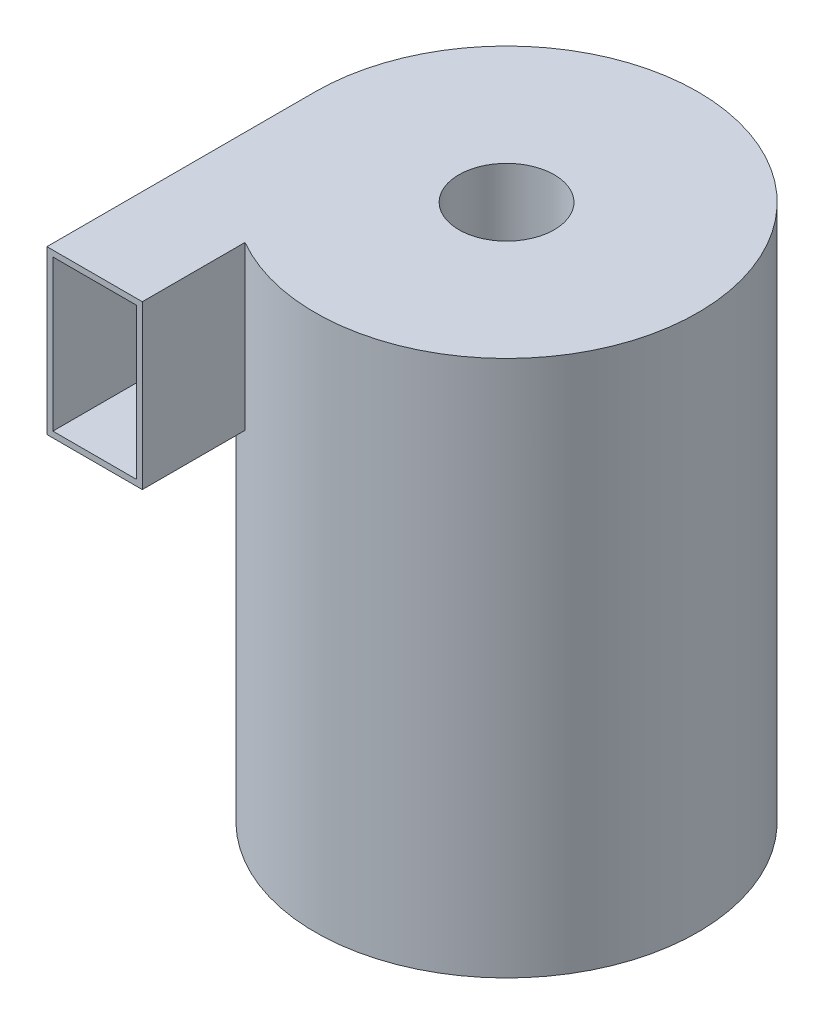
ISO-10303-21;
HEADER;
FILE_DESCRIPTION(('STEP AP214'),'2;1');
FILE_NAME('part.step','',(''),(''),'','','');
FILE_SCHEMA(('AUTOMOTIVE_DESIGN { 1 0 10303 214 1 1 1 1 }'));
ENDSEC;
DATA;
#1=APPLICATION_CONTEXT('core data for automotive mechanical design processes');
#2=APPLICATION_PROTOCOL_DEFINITION('international standard','automotive_design',2000,#1);
#3=PRODUCT_CONTEXT('',#1,'mechanical');
#4=PRODUCT('Part','Part','',(#3));
#5=PRODUCT_RELATED_PRODUCT_CATEGORY('part','',(#4));
#6=PRODUCT_DEFINITION_FORMATION('','',#4);
#7=PRODUCT_DEFINITION_CONTEXT('part definition',#1,'design');
#8=PRODUCT_DEFINITION('design','',#6,#7);
#9=PRODUCT_DEFINITION_SHAPE('','',#8);
#10=(LENGTH_UNIT() NAMED_UNIT(*) SI_UNIT(.MILLI.,.METRE.));
#11=(NAMED_UNIT(*) PLANE_ANGLE_UNIT() SI_UNIT($,.RADIAN.));
#12=(NAMED_UNIT(*) SI_UNIT($,.STERADIAN.) SOLID_ANGLE_UNIT());
#13=UNCERTAINTY_MEASURE_WITH_UNIT(LENGTH_MEASURE(1.E-05),#10,'distance_accuracy_value','');
#14=(GEOMETRIC_REPRESENTATION_CONTEXT(3) GLOBAL_UNCERTAINTY_ASSIGNED_CONTEXT((#13)) GLOBAL_UNIT_ASSIGNED_CONTEXT((#10,
#11,#12)) REPRESENTATION_CONTEXT('',''));
#15=CARTESIAN_POINT('',(0.,0.,0.));
#16=DIRECTION('',(0.,0.,1.));
#17=DIRECTION('',(1.,0.,0.));
#18=AXIS2_PLACEMENT_3D('',#15,#16,#17);
#19=CARTESIAN_POINT('',(0.,0.,0.));
#20=DIRECTION('',(0.,-1.,0.));
#21=DIRECTION('',(0.,0.,-1.));
#22=AXIS2_PLACEMENT_3D('',#19,#20,#21);
#23=CYLINDRICAL_SURFACE('',#22,32.1);
#24=CARTESIAN_POINT('',(0.,0.,0.));
#25=DIRECTION('',(0.,-1.,0.));
#26=DIRECTION('',(0.,0.,-1.));
#27=AXIS2_PLACEMENT_3D('',#24,#25,#26);
#28=CIRCLE('',#27,32.1);
#29=CARTESIAN_POINT('',(0.,0.,-32.1));
#30=VERTEX_POINT('',#29);
#31=EDGE_CURVE('E199',#30,#30,#28,.T.);
#32=ORIENTED_EDGE('',*,*,#31,.F.);
#33=EDGE_LOOP('',(#32));
#34=FACE_BOUND('',#33,.T.);
#35=CARTESIAN_POINT('',(0.,90.,0.));
#36=DIRECTION('',(0.,-1.,0.));
#37=DIRECTION('',(0.,0.,-1.));
#38=AXIS2_PLACEMENT_3D('',#35,#36,#37);
#39=CIRCLE('',#38,32.1);
#40=CARTESIAN_POINT('',(-32.1,90.,0.));
#41=VERTEX_POINT('',#40);
#42=CARTESIAN_POINT('',(-16.1,90.,27.7704879323357));
#43=VERTEX_POINT('',#42);
#44=EDGE_CURVE('E203',#41,#43,#39,.T.);
#45=ORIENTED_EDGE('',*,*,#44,.T.);
#46=DIRECTION('',(0.,-1.,0.));
#47=VECTOR('',#46,1.);
#48=CARTESIAN_POINT('',(-16.1,0.,27.7704879323357));
#49=LINE('',#48,#47);
#50=CARTESIAN_POINT('',(-16.1,62.7,27.7704879323357));
#51=VERTEX_POINT('',#50);
#52=EDGE_CURVE('E11',#43,#51,#49,.T.);
#53=ORIENTED_EDGE('',*,*,#52,.T.);
#54=CARTESIAN_POINT('',(0.,62.7,0.));
#55=DIRECTION('',(0.,1.,0.));
#56=DIRECTION('',(0.,0.,1.));
#57=AXIS2_PLACEMENT_3D('',#54,#55,#56);
#58=CIRCLE('',#57,32.1);
#59=CARTESIAN_POINT('',(-32.1,62.7,0.));
#60=VERTEX_POINT('',#59);
#61=EDGE_CURVE('E48',#51,#60,#58,.F.);
#62=ORIENTED_EDGE('',*,*,#61,.T.);
#63=DIRECTION('',(0.,-1.,0.));
#64=VECTOR('',#63,1.);
#65=CARTESIAN_POINT('',(-32.1,90.,0.));
#66=LINE('',#65,#64);
#67=EDGE_CURVE('E175',#41,#60,#66,.T.);
#68=ORIENTED_EDGE('',*,*,#67,.F.);
#69=EDGE_LOOP('',(#45,#53,#62,#68));
#70=FACE_BOUND('',#69,.T.);
#71=ADVANCED_FACE('F39',(#34,#70),#23,.T.);
#72=CARTESIAN_POINT('',(0.,0.,0.));
#73=DIRECTION('',(0.,-1.,0.));
#74=DIRECTION('',(0.,0.,-1.));
#75=AXIS2_PLACEMENT_3D('',#72,#73,#74);
#76=CYLINDRICAL_SURFACE('',#75,8.);
#77=CARTESIAN_POINT('',(0.,19.,0.));
#78=DIRECTION('',(0.,-1.,0.));
#79=DIRECTION('',(0.,0.,-1.));
#80=AXIS2_PLACEMENT_3D('',#77,#78,#79);
#81=CIRCLE('',#80,8.);
#82=CARTESIAN_POINT('',(0.,19.,-8.));
#83=VERTEX_POINT('',#82);
#84=EDGE_CURVE('E118',#83,#83,#81,.T.);
#85=ORIENTED_EDGE('',*,*,#84,.T.);
#86=EDGE_LOOP('',(#85));
#87=FACE_BOUND('',#86,.T.);
#88=CARTESIAN_POINT('',(0.,90.,0.));
#89=DIRECTION('',(0.,-1.,0.));
#90=DIRECTION('',(0.,0.,-1.));
#91=AXIS2_PLACEMENT_3D('',#88,#89,#90);
#92=CIRCLE('',#91,8.);
#93=CARTESIAN_POINT('',(0.,90.,-8.));
#94=VERTEX_POINT('',#93);
#95=EDGE_CURVE('E207',#94,#94,#92,.T.);
#96=ORIENTED_EDGE('',*,*,#95,.F.);
#97=EDGE_LOOP('',(#96));
#98=FACE_BOUND('',#97,.T.);
#99=ADVANCED_FACE('F41',(#87,#98),#76,.F.);
#100=CARTESIAN_POINT('',(8.,90.,0.));
#101=DIRECTION('',(0.,1.,0.));
#102=DIRECTION('',(0.,0.,1.));
#103=AXIS2_PLACEMENT_3D('',#100,#101,#102);
#104=PLANE('',#103);
#105=DIRECTION('',(0.,0.,-1.));
#106=VECTOR('',#105,1.);
#107=CARTESIAN_POINT('',(-16.1,90.,45.));
#108=LINE('',#107,#106);
#109=CARTESIAN_POINT('',(-16.1,90.,45.));
#110=VERTEX_POINT('',#109);
#111=EDGE_CURVE('E188',#110,#43,#108,.T.);
#112=ORIENTED_EDGE('',*,*,#111,.T.);
#113=ORIENTED_EDGE('',*,*,#44,.F.);
#114=DIRECTION('',(0.,0.,-1.));
#115=VECTOR('',#114,1.);
#116=CARTESIAN_POINT('',(-32.1,90.,45.));
#117=LINE('',#116,#115);
#118=CARTESIAN_POINT('',(-32.1,90.,45.));
#119=VERTEX_POINT('',#118);
#120=EDGE_CURVE('E63',#119,#41,#117,.T.);
#121=ORIENTED_EDGE('',*,*,#120,.F.);
#122=DIRECTION('',(-1.,0.,0.));
#123=VECTOR('',#122,1.);
#124=CARTESIAN_POINT('',(-32.1,90.,45.));
#125=LINE('',#124,#123);
#126=EDGE_CURVE('E181',#110,#119,#125,.T.);
#127=ORIENTED_EDGE('',*,*,#126,.F.);
#128=EDGE_LOOP('',(#112,#113,#121,#127));
#129=FACE_BOUND('',#128,.T.);
#130=ORIENTED_EDGE('',*,*,#95,.T.);
#131=EDGE_LOOP('',(#130));
#132=FACE_BOUND('',#131,.T.);
#133=ADVANCED_FACE('F237',(#129,#132),#104,.T.);
#134=CARTESIAN_POINT('',(32.1,0.,0.));
#135=DIRECTION('',(0.,-1.,0.));
#136=DIRECTION('',(0.,0.,-1.));
#137=AXIS2_PLACEMENT_3D('',#134,#135,#136);
#138=PLANE('',#137);
#139=CARTESIAN_POINT('',(0.,0.,0.));
#140=DIRECTION('',(0.,-1.,0.));
#141=DIRECTION('',(0.,0.,-1.));
#142=AXIS2_PLACEMENT_3D('',#139,#140,#141);
#143=CIRCLE('',#142,31.1);
#144=CARTESIAN_POINT('',(0.,0.,-31.1));
#145=VERTEX_POINT('',#144);
#146=EDGE_CURVE('E134',#145,#145,#143,.T.);
#147=ORIENTED_EDGE('',*,*,#146,.F.);
#148=EDGE_LOOP('',(#147));
#149=FACE_BOUND('',#148,.T.);
#150=ORIENTED_EDGE('',*,*,#31,.T.);
#151=EDGE_LOOP('',(#150));
#152=FACE_BOUND('',#151,.T.);
#153=ADVANCED_FACE('F230',(#149,#152),#138,.T.);
#154=CARTESIAN_POINT('',(-32.1,90.,45.));
#155=DIRECTION('',(1.,0.,0.));
#156=DIRECTION('',(0.,0.,-1.));
#157=AXIS2_PLACEMENT_3D('',#154,#155,#156);
#158=PLANE('',#157);
#159=ORIENTED_EDGE('',*,*,#67,.T.);
#160=DIRECTION('',(0.,0.,-1.));
#161=VECTOR('',#160,1.);
#162=CARTESIAN_POINT('',(-32.1,62.7,45.));
#163=LINE('',#162,#161);
#164=CARTESIAN_POINT('',(-32.1,62.7,45.));
#165=VERTEX_POINT('',#164);
#166=EDGE_CURVE('E196',#165,#60,#163,.T.);
#167=ORIENTED_EDGE('',*,*,#166,.F.);
#168=DIRECTION('',(0.,-1.,0.));
#169=VECTOR('',#168,1.);
#170=CARTESIAN_POINT('',(-32.1,90.,45.));
#171=LINE('',#170,#169);
#172=EDGE_CURVE('E170',#119,#165,#171,.T.);
#173=ORIENTED_EDGE('',*,*,#172,.F.);
#174=ORIENTED_EDGE('',*,*,#120,.T.);
#175=EDGE_LOOP('',(#159,#167,#173,#174));
#176=FACE_BOUND('',#175,.T.);
#177=ADVANCED_FACE('F228',(#176),#158,.F.);
#178=CARTESIAN_POINT('',(-32.1,62.7,45.));
#179=DIRECTION('',(0.,1.,0.));
#180=DIRECTION('',(0.,0.,1.));
#181=AXIS2_PLACEMENT_3D('',#178,#179,#180);
#182=PLANE('',#181);
#183=ORIENTED_EDGE('',*,*,#61,.F.);
#184=DIRECTION('',(0.,0.,-1.));
#185=VECTOR('',#184,1.);
#186=CARTESIAN_POINT('',(-16.1,62.7,45.));
#187=LINE('',#186,#185);
#188=CARTESIAN_POINT('',(-16.1,62.7,45.));
#189=VERTEX_POINT('',#188);
#190=EDGE_CURVE('E192',#189,#51,#187,.T.);
#191=ORIENTED_EDGE('',*,*,#190,.F.);
#192=DIRECTION('',(1.,0.,0.));
#193=VECTOR('',#192,1.);
#194=CARTESIAN_POINT('',(-32.1,62.7,45.));
#195=LINE('',#194,#193);
#196=EDGE_CURVE('E174',#165,#189,#195,.T.);
#197=ORIENTED_EDGE('',*,*,#196,.F.);
#198=ORIENTED_EDGE('',*,*,#166,.T.);
#199=EDGE_LOOP('',(#183,#191,#197,#198));
#200=FACE_BOUND('',#199,.T.);
#201=ADVANCED_FACE('F219',(#200),#182,.F.);
#202=CARTESIAN_POINT('',(-16.1,90.,45.));
#203=DIRECTION('',(-1.,0.,0.));
#204=DIRECTION('',(0.,0.,1.));
#205=AXIS2_PLACEMENT_3D('',#202,#203,#204);
#206=PLANE('',#205);
#207=ORIENTED_EDGE('',*,*,#52,.F.);
#208=ORIENTED_EDGE('',*,*,#111,.F.);
#209=DIRECTION('',(0.,1.,0.));
#210=VECTOR('',#209,1.);
#211=CARTESIAN_POINT('',(-16.1,90.,45.));
#212=LINE('',#211,#210);
#213=EDGE_CURVE('E178',#189,#110,#212,.T.);
#214=ORIENTED_EDGE('',*,*,#213,.F.);
#215=ORIENTED_EDGE('',*,*,#190,.T.);
#216=EDGE_LOOP('',(#207,#208,#214,#215));
#217=FACE_BOUND('',#216,.T.);
#218=ADVANCED_FACE('F223',(#217),#206,.F.);
#219=CARTESIAN_POINT('',(0.,0.,45.));
#220=DIRECTION('',(0.,0.,1.));
#221=DIRECTION('',(1.,0.,0.));
#222=AXIS2_PLACEMENT_3D('',#219,#220,#221);
#223=PLANE('',#222);
#224=DIRECTION('',(0.,-1.,0.));
#225=VECTOR('',#224,1.);
#226=CARTESIAN_POINT('',(-31.1,90.,45.));
#227=LINE('',#226,#225);
#228=CARTESIAN_POINT('',(-31.1,89.,45.));
#229=VERTEX_POINT('',#228);
#230=CARTESIAN_POINT('',(-31.1,63.7,45.));
#231=VERTEX_POINT('',#230);
#232=EDGE_CURVE('E149',#229,#231,#227,.T.);
#233=ORIENTED_EDGE('',*,*,#232,.F.);
#234=DIRECTION('',(-1.,0.,0.));
#235=VECTOR('',#234,1.);
#236=CARTESIAN_POINT('',(0.,89.,45.));
#237=LINE('',#236,#235);
#238=CARTESIAN_POINT('',(-17.1,89.,45.));
#239=VERTEX_POINT('',#238);
#240=EDGE_CURVE('E152',#239,#229,#237,.T.);
#241=ORIENTED_EDGE('',*,*,#240,.F.);
#242=DIRECTION('',(0.,1.,0.));
#243=VECTOR('',#242,1.);
#244=CARTESIAN_POINT('',(-17.1,90.,45.));
#245=LINE('',#244,#243);
#246=CARTESIAN_POINT('',(-17.1,63.7,45.));
#247=VERTEX_POINT('',#246);
#248=EDGE_CURVE('E122',#247,#239,#245,.T.);
#249=ORIENTED_EDGE('',*,*,#248,.F.);
#250=DIRECTION('',(1.,0.,0.));
#251=VECTOR('',#250,1.);
#252=CARTESIAN_POINT('',(-32.1,63.7,45.));
#253=LINE('',#252,#251);
#254=EDGE_CURVE('E162',#231,#247,#253,.T.);
#255=ORIENTED_EDGE('',*,*,#254,.F.);
#256=EDGE_LOOP('',(#233,#241,#249,#255));
#257=FACE_BOUND('',#256,.T.);
#258=ORIENTED_EDGE('',*,*,#172,.T.);
#259=ORIENTED_EDGE('',*,*,#196,.T.);
#260=ORIENTED_EDGE('',*,*,#213,.T.);
#261=ORIENTED_EDGE('',*,*,#126,.T.);
#262=EDGE_LOOP('',(#258,#259,#260,#261));
#263=FACE_BOUND('',#262,.T.);
#264=ADVANCED_FACE('F227',(#257,#263),#223,.T.);
#265=CARTESIAN_POINT('',(0.,19.,0.));
#266=DIRECTION('',(0.,1.,0.));
#267=DIRECTION('',(0.,0.,1.));
#268=AXIS2_PLACEMENT_3D('',#265,#266,#267);
#269=PLANE('',#268);
#270=CARTESIAN_POINT('',(0.,19.,0.));
#271=DIRECTION('',(0.,1.,0.));
#272=DIRECTION('',(0.,0.,1.));
#273=AXIS2_PLACEMENT_3D('',#270,#271,#272);
#274=CIRCLE('',#273,9.);
#275=CARTESIAN_POINT('',(0.,19.,9.));
#276=VERTEX_POINT('',#275);
#277=EDGE_CURVE('E139',#276,#276,#274,.F.);
#278=ORIENTED_EDGE('',*,*,#277,.T.);
#279=EDGE_LOOP('',(#278));
#280=FACE_BOUND('',#279,.T.);
#281=ORIENTED_EDGE('',*,*,#84,.F.);
#282=EDGE_LOOP('',(#281));
#283=FACE_BOUND('',#282,.T.);
#284=ADVANCED_FACE('F277',(#280,#283),#269,.F.);
#285=CARTESIAN_POINT('',(0.,0.,0.));
#286=DIRECTION('',(0.,-1.,0.));
#287=DIRECTION('',(0.,0.,-1.));
#288=AXIS2_PLACEMENT_3D('',#285,#286,#287);
#289=CYLINDRICAL_SURFACE('',#288,31.1);
#290=ORIENTED_EDGE('',*,*,#146,.T.);
#291=EDGE_LOOP('',(#290));
#292=FACE_BOUND('',#291,.T.);
#293=CARTESIAN_POINT('',(0.,89.,0.));
#294=DIRECTION('',(0.,1.,0.));
#295=DIRECTION('',(0.,0.,1.));
#296=AXIS2_PLACEMENT_3D('',#293,#294,#295);
#297=CIRCLE('',#296,31.1);
#298=CARTESIAN_POINT('',(-31.1,89.,0.));
#299=VERTEX_POINT('',#298);
#300=CARTESIAN_POINT('',(-17.1,89.,25.9769128265851));
#301=VERTEX_POINT('',#300);
#302=EDGE_CURVE('E111',#299,#301,#297,.F.);
#303=ORIENTED_EDGE('',*,*,#302,.F.);
#304=DIRECTION('',(0.,1.,0.));
#305=VECTOR('',#304,1.);
#306=CARTESIAN_POINT('',(-31.1,90.,0.));
#307=LINE('',#306,#305);
#308=CARTESIAN_POINT('',(-31.1,63.7,0.));
#309=VERTEX_POINT('',#308);
#310=EDGE_CURVE('E147',#299,#309,#307,.F.);
#311=ORIENTED_EDGE('',*,*,#310,.T.);
#312=CARTESIAN_POINT('',(0.,63.7,0.));
#313=DIRECTION('',(0.,1.,0.));
#314=DIRECTION('',(0.,0.,1.));
#315=AXIS2_PLACEMENT_3D('',#312,#313,#314);
#316=CIRCLE('',#315,31.1);
#317=CARTESIAN_POINT('',(-17.1,63.7,25.9769128265851));
#318=VERTEX_POINT('',#317);
#319=EDGE_CURVE('E113',#318,#309,#316,.F.);
#320=ORIENTED_EDGE('',*,*,#319,.F.);
#321=DIRECTION('',(0.,-1.,0.));
#322=VECTOR('',#321,1.);
#323=CARTESIAN_POINT('',(-17.1,89.,25.9769128265851));
#324=LINE('',#323,#322);
#325=EDGE_CURVE('E108',#301,#318,#324,.T.);
#326=ORIENTED_EDGE('',*,*,#325,.F.);
#327=EDGE_LOOP('',(#303,#311,#320,#326));
#328=FACE_BOUND('',#327,.T.);
#329=ADVANCED_FACE('F109',(#292,#328),#289,.F.);
#330=CARTESIAN_POINT('',(0.,0.,0.));
#331=DIRECTION('',(0.,-1.,0.));
#332=DIRECTION('',(0.,0.,-1.));
#333=AXIS2_PLACEMENT_3D('',#330,#331,#332);
#334=CYLINDRICAL_SURFACE('',#333,9.);
#335=ORIENTED_EDGE('',*,*,#277,.F.);
#336=EDGE_LOOP('',(#335));
#337=FACE_BOUND('',#336,.T.);
#338=CARTESIAN_POINT('',(0.,89.,0.));
#339=DIRECTION('',(0.,1.,0.));
#340=DIRECTION('',(0.,0.,1.));
#341=AXIS2_PLACEMENT_3D('',#338,#339,#340);
#342=CIRCLE('',#341,9.);
#343=CARTESIAN_POINT('',(0.,89.,9.));
#344=VERTEX_POINT('',#343);
#345=EDGE_CURVE('E133',#344,#344,#342,.F.);
#346=ORIENTED_EDGE('',*,*,#345,.T.);
#347=EDGE_LOOP('',(#346));
#348=FACE_BOUND('',#347,.T.);
#349=ADVANCED_FACE('F296',(#337,#348),#334,.T.);
#350=CARTESIAN_POINT('',(8.,89.,0.));
#351=DIRECTION('',(0.,1.,0.));
#352=DIRECTION('',(0.,0.,1.));
#353=AXIS2_PLACEMENT_3D('',#350,#351,#352);
#354=PLANE('',#353);
#355=DIRECTION('',(0.,0.,-1.));
#356=VECTOR('',#355,1.);
#357=CARTESIAN_POINT('',(-17.1,89.,45.));
#358=LINE('',#357,#356);
#359=EDGE_CURVE('E55',#239,#301,#358,.T.);
#360=ORIENTED_EDGE('',*,*,#359,.F.);
#361=ORIENTED_EDGE('',*,*,#240,.T.);
#362=DIRECTION('',(0.,0.,-1.));
#363=VECTOR('',#362,1.);
#364=CARTESIAN_POINT('',(-31.1,89.,0.));
#365=LINE('',#364,#363);
#366=EDGE_CURVE('E126',#229,#299,#365,.T.);
#367=ORIENTED_EDGE('',*,*,#366,.T.);
#368=ORIENTED_EDGE('',*,*,#302,.T.);
#369=EDGE_LOOP('',(#360,#361,#367,#368));
#370=FACE_BOUND('',#369,.T.);
#371=ORIENTED_EDGE('',*,*,#345,.F.);
#372=EDGE_LOOP('',(#371));
#373=FACE_BOUND('',#372,.T.);
#374=ADVANCED_FACE('F128',(#370,#373),#354,.F.);
#375=CARTESIAN_POINT('',(-31.1,90.,45.));
#376=DIRECTION('',(1.,0.,0.));
#377=DIRECTION('',(0.,0.,-1.));
#378=AXIS2_PLACEMENT_3D('',#375,#376,#377);
#379=PLANE('',#378);
#380=ORIENTED_EDGE('',*,*,#310,.F.);
#381=ORIENTED_EDGE('',*,*,#366,.F.);
#382=ORIENTED_EDGE('',*,*,#232,.T.);
#383=DIRECTION('',(0.,0.,-1.));
#384=VECTOR('',#383,1.);
#385=CARTESIAN_POINT('',(-31.1,63.7,45.));
#386=LINE('',#385,#384);
#387=EDGE_CURVE('E142',#231,#309,#386,.T.);
#388=ORIENTED_EDGE('',*,*,#387,.T.);
#389=EDGE_LOOP('',(#380,#381,#382,#388));
#390=FACE_BOUND('',#389,.T.);
#391=ADVANCED_FACE('F316',(#390),#379,.T.);
#392=CARTESIAN_POINT('',(-32.1,63.7,45.));
#393=DIRECTION('',(0.,1.,0.));
#394=DIRECTION('',(0.,0.,1.));
#395=AXIS2_PLACEMENT_3D('',#392,#393,#394);
#396=PLANE('',#395);
#397=ORIENTED_EDGE('',*,*,#319,.T.);
#398=ORIENTED_EDGE('',*,*,#387,.F.);
#399=ORIENTED_EDGE('',*,*,#254,.T.);
#400=DIRECTION('',(0.,0.,-1.));
#401=VECTOR('',#400,1.);
#402=CARTESIAN_POINT('',(-17.1,63.7,45.));
#403=LINE('',#402,#401);
#404=EDGE_CURVE('E125',#247,#318,#403,.T.);
#405=ORIENTED_EDGE('',*,*,#404,.T.);
#406=EDGE_LOOP('',(#397,#398,#399,#405));
#407=FACE_BOUND('',#406,.T.);
#408=ADVANCED_FACE('F325',(#407),#396,.T.);
#409=CARTESIAN_POINT('',(-17.1,90.,45.));
#410=DIRECTION('',(-1.,0.,0.));
#411=DIRECTION('',(0.,0.,1.));
#412=AXIS2_PLACEMENT_3D('',#409,#410,#411);
#413=PLANE('',#412);
#414=ORIENTED_EDGE('',*,*,#325,.T.);
#415=ORIENTED_EDGE('',*,*,#404,.F.);
#416=ORIENTED_EDGE('',*,*,#248,.T.);
#417=ORIENTED_EDGE('',*,*,#359,.T.);
#418=EDGE_LOOP('',(#414,#415,#416,#417));
#419=FACE_BOUND('',#418,.T.);
#420=ADVANCED_FACE('F120',(#419),#413,.T.);
#421=CLOSED_SHELL('',(#71,#99,#133,#153,#177,#201,#218,#264,#284,#329,#349,#374,#391,#408,#420));
#422=MANIFOLD_SOLID_BREP('B2',#421);
#423=ADVANCED_BREP_SHAPE_REPRESENTATION('',(#18,#422),#14);
#424=SHAPE_DEFINITION_REPRESENTATION(#9,#423);
ENDSEC;
END-ISO-10303-21;
